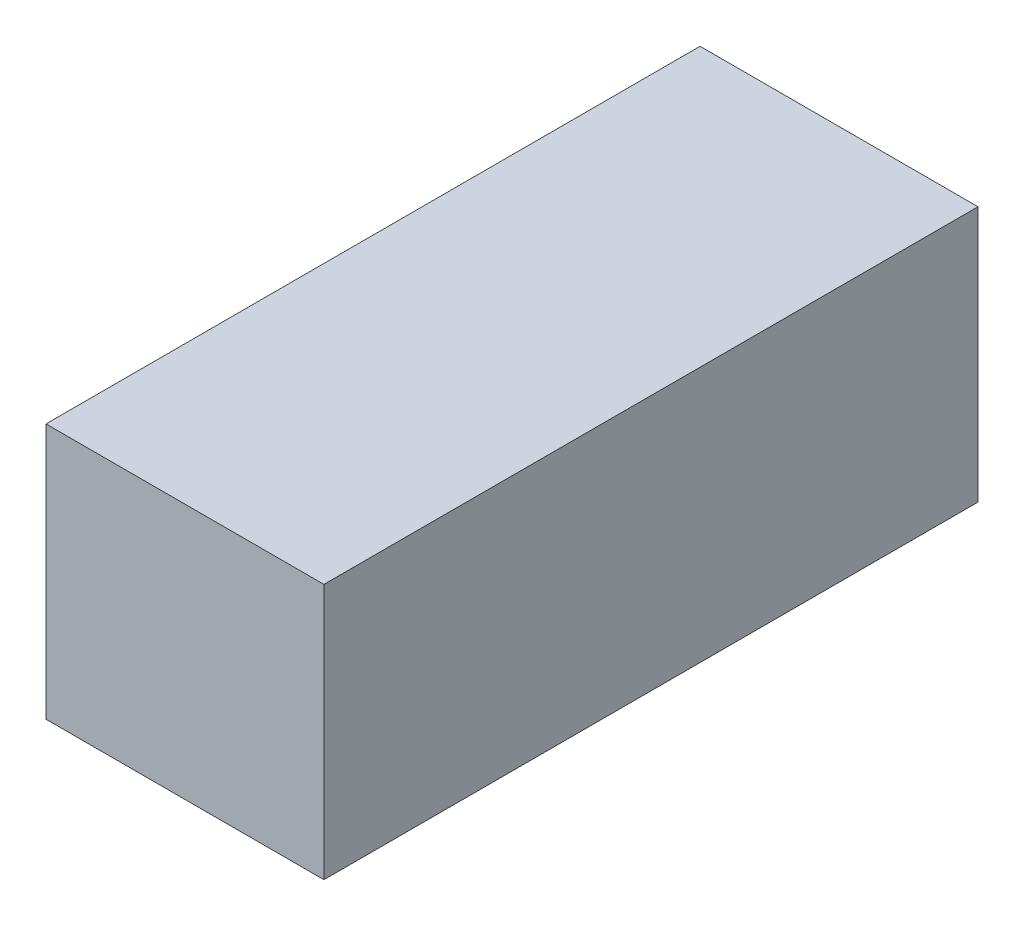
ISO-10303-21;
HEADER;
FILE_DESCRIPTION(('STEP AP214'),'2;1');
FILE_NAME('part.step','',(''),(''),'','','');
FILE_SCHEMA(('AUTOMOTIVE_DESIGN { 1 0 10303 214 1 1 1 1 }'));
ENDSEC;
DATA;
#1=APPLICATION_CONTEXT('core data for automotive mechanical design processes');
#2=APPLICATION_PROTOCOL_DEFINITION('international standard','automotive_design',2000,#1);
#3=PRODUCT_CONTEXT('',#1,'mechanical');
#4=PRODUCT('Part','Part','',(#3));
#5=PRODUCT_RELATED_PRODUCT_CATEGORY('part','',(#4));
#6=PRODUCT_DEFINITION_FORMATION('','',#4);
#7=PRODUCT_DEFINITION_CONTEXT('part definition',#1,'design');
#8=PRODUCT_DEFINITION('design','',#6,#7);
#9=PRODUCT_DEFINITION_SHAPE('','',#8);
#10=(LENGTH_UNIT() NAMED_UNIT(*) SI_UNIT(.MILLI.,.METRE.));
#11=(NAMED_UNIT(*) PLANE_ANGLE_UNIT() SI_UNIT($,.RADIAN.));
#12=(NAMED_UNIT(*) SI_UNIT($,.STERADIAN.) SOLID_ANGLE_UNIT());
#13=UNCERTAINTY_MEASURE_WITH_UNIT(LENGTH_MEASURE(1.E-05),#10,'distance_accuracy_value','');
#14=(GEOMETRIC_REPRESENTATION_CONTEXT(3) GLOBAL_UNCERTAINTY_ASSIGNED_CONTEXT((#13)) GLOBAL_UNIT_ASSIGNED_CONTEXT((#10,
#11,#12)) REPRESENTATION_CONTEXT('',''));
#15=CARTESIAN_POINT('',(0.,0.,0.));
#16=DIRECTION('',(0.,0.,1.));
#17=DIRECTION('',(1.,0.,0.));
#18=AXIS2_PLACEMENT_3D('',#15,#16,#17);
#19=CARTESIAN_POINT('',(17.55,-16.15,-41.3));
#20=DIRECTION('',(1.,0.,0.));
#21=DIRECTION('',(0.,0.,-1.));
#22=AXIS2_PLACEMENT_3D('',#19,#20,#21);
#23=PLANE('',#22);
#24=DIRECTION('',(0.,0.,1.));
#25=VECTOR('',#24,1.);
#26=CARTESIAN_POINT('',(17.55,16.15,-41.3));
#27=LINE('',#26,#25);
#28=CARTESIAN_POINT('',(17.55,16.15,-41.3));
#29=VERTEX_POINT('',#28);
#30=CARTESIAN_POINT('',(17.55,16.15,41.3));
#31=VERTEX_POINT('',#30);
#32=EDGE_CURVE('E44',#29,#31,#27,.T.);
#33=ORIENTED_EDGE('',*,*,#32,.T.);
#34=DIRECTION('',(0.,1.,0.));
#35=VECTOR('',#34,1.);
#36=CARTESIAN_POINT('',(17.55,-16.15,41.3));
#37=LINE('',#36,#35);
#38=CARTESIAN_POINT('',(17.55,-16.15,41.3));
#39=VERTEX_POINT('',#38);
#40=EDGE_CURVE('E81',#39,#31,#37,.T.);
#41=ORIENTED_EDGE('',*,*,#40,.F.);
#42=DIRECTION('',(0.,0.,1.));
#43=VECTOR('',#42,1.);
#44=CARTESIAN_POINT('',(17.55,-16.15,-41.3));
#45=LINE('',#44,#43);
#46=CARTESIAN_POINT('',(17.55,-16.15,-41.3));
#47=VERTEX_POINT('',#46);
#48=EDGE_CURVE('E11',#47,#39,#45,.T.);
#49=ORIENTED_EDGE('',*,*,#48,.F.);
#50=DIRECTION('',(0.,1.,0.));
#51=VECTOR('',#50,1.);
#52=CARTESIAN_POINT('',(17.55,-16.15,-41.3));
#53=LINE('',#52,#51);
#54=EDGE_CURVE('E82',#47,#29,#53,.T.);
#55=ORIENTED_EDGE('',*,*,#54,.T.);
#56=EDGE_LOOP('',(#33,#41,#49,#55));
#57=FACE_BOUND('',#56,.T.);
#58=ADVANCED_FACE('F41',(#57),#23,.T.);
#59=CARTESIAN_POINT('',(-17.55,-16.15,-41.3));
#60=DIRECTION('',(0.,-1.,0.));
#61=DIRECTION('',(0.,0.,-1.));
#62=AXIS2_PLACEMENT_3D('',#59,#60,#61);
#63=PLANE('',#62);
#64=ORIENTED_EDGE('',*,*,#48,.T.);
#65=DIRECTION('',(1.,0.,0.));
#66=VECTOR('',#65,1.);
#67=CARTESIAN_POINT('',(-17.55,-16.15,41.3));
#68=LINE('',#67,#66);
#69=CARTESIAN_POINT('',(-17.55,-16.15,41.3));
#70=VERTEX_POINT('',#69);
#71=EDGE_CURVE('E98',#70,#39,#68,.T.);
#72=ORIENTED_EDGE('',*,*,#71,.F.);
#73=DIRECTION('',(0.,0.,1.));
#74=VECTOR('',#73,1.);
#75=CARTESIAN_POINT('',(-17.55,-16.15,-41.3));
#76=LINE('',#75,#74);
#77=CARTESIAN_POINT('',(-17.55,-16.15,-41.3));
#78=VERTEX_POINT('',#77);
#79=EDGE_CURVE('E49',#78,#70,#76,.T.);
#80=ORIENTED_EDGE('',*,*,#79,.F.);
#81=DIRECTION('',(1.,0.,0.));
#82=VECTOR('',#81,1.);
#83=CARTESIAN_POINT('',(-17.55,-16.15,-41.3));
#84=LINE('',#83,#82);
#85=EDGE_CURVE('E87',#78,#47,#84,.T.);
#86=ORIENTED_EDGE('',*,*,#85,.T.);
#87=EDGE_LOOP('',(#64,#72,#80,#86));
#88=FACE_BOUND('',#87,.T.);
#89=ADVANCED_FACE('F113',(#88),#63,.T.);
#90=CARTESIAN_POINT('',(-17.55,-16.15,-41.3));
#91=DIRECTION('',(-1.,0.,0.));
#92=DIRECTION('',(0.,0.,1.));
#93=AXIS2_PLACEMENT_3D('',#90,#91,#92);
#94=PLANE('',#93);
#95=ORIENTED_EDGE('',*,*,#79,.T.);
#96=DIRECTION('',(0.,-1.,0.));
#97=VECTOR('',#96,1.);
#98=CARTESIAN_POINT('',(-17.55,-16.15,41.3));
#99=LINE('',#98,#97);
#100=CARTESIAN_POINT('',(-17.55,16.15,41.3));
#101=VERTEX_POINT('',#100);
#102=EDGE_CURVE('E94',#101,#70,#99,.T.);
#103=ORIENTED_EDGE('',*,*,#102,.F.);
#104=DIRECTION('',(0.,0.,1.));
#105=VECTOR('',#104,1.);
#106=CARTESIAN_POINT('',(-17.55,16.15,-41.3));
#107=LINE('',#106,#105);
#108=CARTESIAN_POINT('',(-17.55,16.15,-41.3));
#109=VERTEX_POINT('',#108);
#110=EDGE_CURVE('E86',#109,#101,#107,.T.);
#111=ORIENTED_EDGE('',*,*,#110,.F.);
#112=DIRECTION('',(0.,-1.,0.));
#113=VECTOR('',#112,1.);
#114=CARTESIAN_POINT('',(-17.55,-16.15,-41.3));
#115=LINE('',#114,#113);
#116=EDGE_CURVE('E106',#109,#78,#115,.T.);
#117=ORIENTED_EDGE('',*,*,#116,.T.);
#118=EDGE_LOOP('',(#95,#103,#111,#117));
#119=FACE_BOUND('',#118,.T.);
#120=ADVANCED_FACE('F110',(#119),#94,.T.);
#121=CARTESIAN_POINT('',(-17.55,16.15,-41.3));
#122=DIRECTION('',(0.,1.,0.));
#123=DIRECTION('',(0.,0.,1.));
#124=AXIS2_PLACEMENT_3D('',#121,#122,#123);
#125=PLANE('',#124);
#126=ORIENTED_EDGE('',*,*,#110,.T.);
#127=DIRECTION('',(-1.,0.,0.));
#128=VECTOR('',#127,1.);
#129=CARTESIAN_POINT('',(-17.55,16.15,41.3));
#130=LINE('',#129,#128);
#131=EDGE_CURVE('E89',#31,#101,#130,.T.);
#132=ORIENTED_EDGE('',*,*,#131,.F.);
#133=ORIENTED_EDGE('',*,*,#32,.F.);
#134=DIRECTION('',(-1.,0.,0.));
#135=VECTOR('',#134,1.);
#136=CARTESIAN_POINT('',(-17.55,16.15,-41.3));
#137=LINE('',#136,#135);
#138=EDGE_CURVE('E104',#29,#109,#137,.T.);
#139=ORIENTED_EDGE('',*,*,#138,.T.);
#140=EDGE_LOOP('',(#126,#132,#133,#139));
#141=FACE_BOUND('',#140,.T.);
#142=ADVANCED_FACE('F90',(#141),#125,.T.);
#143=CARTESIAN_POINT('',(0.,0.,-41.3));
#144=DIRECTION('',(0.,0.,-1.));
#145=DIRECTION('',(-1.,0.,0.));
#146=AXIS2_PLACEMENT_3D('',#143,#144,#145);
#147=PLANE('',#146);
#148=ORIENTED_EDGE('',*,*,#54,.F.);
#149=ORIENTED_EDGE('',*,*,#85,.F.);
#150=ORIENTED_EDGE('',*,*,#116,.F.);
#151=ORIENTED_EDGE('',*,*,#138,.F.);
#152=EDGE_LOOP('',(#148,#149,#150,#151));
#153=FACE_BOUND('',#152,.T.);
#154=ADVANCED_FACE('F115',(#153),#147,.T.);
#155=CARTESIAN_POINT('',(0.,0.,41.3));
#156=DIRECTION('',(0.,0.,-1.));
#157=DIRECTION('',(-1.,0.,0.));
#158=AXIS2_PLACEMENT_3D('',#155,#156,#157);
#159=PLANE('',#158);
#160=ORIENTED_EDGE('',*,*,#40,.T.);
#161=ORIENTED_EDGE('',*,*,#131,.T.);
#162=ORIENTED_EDGE('',*,*,#102,.T.);
#163=ORIENTED_EDGE('',*,*,#71,.T.);
#164=EDGE_LOOP('',(#160,#161,#162,#163));
#165=FACE_BOUND('',#164,.T.);
#166=ADVANCED_FACE('F97',(#165),#159,.F.);
#167=CLOSED_SHELL('',(#58,#89,#120,#142,#154,#166));
#168=MANIFOLD_SOLID_BREP('B2',#167);
#169=ADVANCED_BREP_SHAPE_REPRESENTATION('',(#18,#168),#14);
#170=SHAPE_DEFINITION_REPRESENTATION(#9,#169);
ENDSEC;
END-ISO-10303-21;
